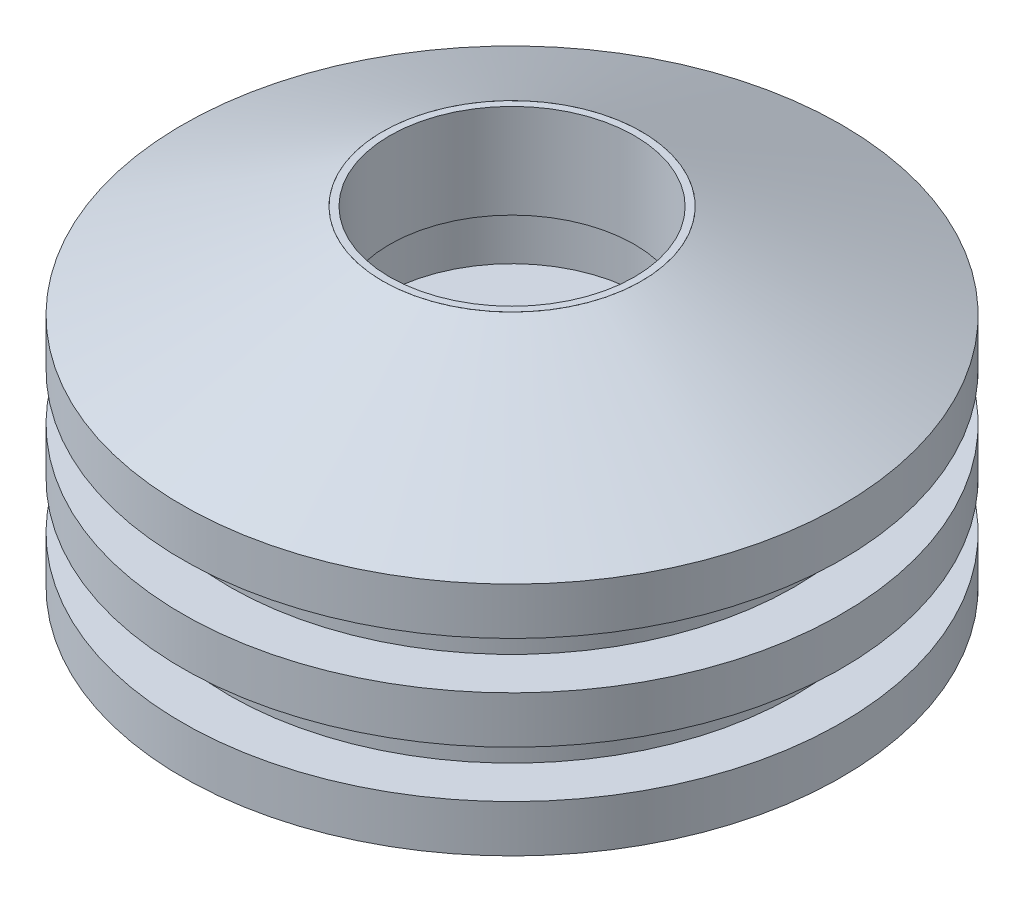
ISO-10303-21;
HEADER;
FILE_DESCRIPTION(('STEP AP214'),'2;1');
FILE_NAME('part.step','',(''),(''),'','','');
FILE_SCHEMA(('AUTOMOTIVE_DESIGN { 1 0 10303 214 1 1 1 1 }'));
ENDSEC;
DATA;
#1=APPLICATION_CONTEXT('core data for automotive mechanical design processes');
#2=APPLICATION_PROTOCOL_DEFINITION('international standard','automotive_design',2000,#1);
#3=PRODUCT_CONTEXT('',#1,'mechanical');
#4=PRODUCT('Part','Part','',(#3));
#5=PRODUCT_RELATED_PRODUCT_CATEGORY('part','',(#4));
#6=PRODUCT_DEFINITION_FORMATION('','',#4);
#7=PRODUCT_DEFINITION_CONTEXT('part definition',#1,'design');
#8=PRODUCT_DEFINITION('design','',#6,#7);
#9=PRODUCT_DEFINITION_SHAPE('','',#8);
#10=(LENGTH_UNIT() NAMED_UNIT(*) SI_UNIT(.MILLI.,.METRE.));
#11=(NAMED_UNIT(*) PLANE_ANGLE_UNIT() SI_UNIT($,.RADIAN.));
#12=(NAMED_UNIT(*) SI_UNIT($,.STERADIAN.) SOLID_ANGLE_UNIT());
#13=UNCERTAINTY_MEASURE_WITH_UNIT(LENGTH_MEASURE(1.E-05),#10,'distance_accuracy_value','');
#14=(GEOMETRIC_REPRESENTATION_CONTEXT(3) GLOBAL_UNCERTAINTY_ASSIGNED_CONTEXT((#13)) GLOBAL_UNIT_ASSIGNED_CONTEXT((#10,
#11,#12)) REPRESENTATION_CONTEXT('',''));
#15=CARTESIAN_POINT('',(0.,0.,0.));
#16=DIRECTION('',(0.,0.,1.));
#17=DIRECTION('',(1.,0.,0.));
#18=AXIS2_PLACEMENT_3D('',#15,#16,#17);
#19=CARTESIAN_POINT('',(0.,0.,0.));
#20=DIRECTION('',(0.,1.,0.));
#21=DIRECTION('',(0.,0.,1.));
#22=AXIS2_PLACEMENT_3D('',#19,#20,#21);
#23=CYLINDRICAL_SURFACE('',#22,8.73125);
#24=CARTESIAN_POINT('',(0.,0.,0.));
#25=DIRECTION('',(0.,1.,0.));
#26=DIRECTION('',(0.,0.,1.));
#27=AXIS2_PLACEMENT_3D('',#24,#25,#26);
#28=CIRCLE('',#27,8.73125);
#29=CARTESIAN_POINT('',(0.,0.,8.73125));
#30=VERTEX_POINT('',#29);
#31=EDGE_CURVE('E11',#30,#30,#28,.T.);
#32=ORIENTED_EDGE('',*,*,#31,.T.);
#33=EDGE_LOOP('',(#32));
#34=FACE_BOUND('',#33,.T.);
#35=CARTESIAN_POINT('',(0.,6.35,0.));
#36=DIRECTION('',(0.,1.,0.));
#37=DIRECTION('',(0.,0.,1.));
#38=AXIS2_PLACEMENT_3D('',#35,#36,#37);
#39=CIRCLE('',#38,8.73125);
#40=CARTESIAN_POINT('',(0.,6.35,8.73125));
#41=VERTEX_POINT('',#40);
#42=EDGE_CURVE('E52',#41,#41,#39,.T.);
#43=ORIENTED_EDGE('',*,*,#42,.F.);
#44=EDGE_LOOP('',(#43));
#45=FACE_BOUND('',#44,.T.);
#46=ADVANCED_FACE('F49',(#34,#45),#23,.T.);
#47=CARTESIAN_POINT('',(0.,0.,0.));
#48=DIRECTION('',(0.,1.,0.));
#49=DIRECTION('',(0.,0.,1.));
#50=AXIS2_PLACEMENT_3D('',#47,#48,#49);
#51=PLANE('',#50);
#52=CARTESIAN_POINT('',(0.,0.,0.));
#53=DIRECTION('',(0.,1.,0.));
#54=DIRECTION('',(0.,0.,1.));
#55=AXIS2_PLACEMENT_3D('',#52,#53,#54);
#56=CIRCLE('',#55,8.255);
#57=CARTESIAN_POINT('',(0.,0.,8.255));
#58=VERTEX_POINT('',#57);
#59=EDGE_CURVE('E59',#58,#58,#56,.T.);
#60=ORIENTED_EDGE('',*,*,#59,.T.);
#61=EDGE_LOOP('',(#60));
#62=FACE_BOUND('',#61,.T.);
#63=ORIENTED_EDGE('',*,*,#31,.F.);
#64=EDGE_LOOP('',(#63));
#65=FACE_BOUND('',#64,.T.);
#66=ADVANCED_FACE('F73',(#62,#65),#51,.F.);
#67=CARTESIAN_POINT('',(0.,6.35,0.));
#68=DIRECTION('',(0.,1.,0.));
#69=DIRECTION('',(0.,0.,1.));
#70=AXIS2_PLACEMENT_3D('',#67,#68,#69);
#71=PLANE('',#70);
#72=CARTESIAN_POINT('',(0.,6.35,0.));
#73=DIRECTION('',(0.,1.,0.));
#74=DIRECTION('',(0.,0.,1.));
#75=AXIS2_PLACEMENT_3D('',#72,#73,#74);
#76=CIRCLE('',#75,8.255);
#77=CARTESIAN_POINT('',(0.,6.35,8.255));
#78=VERTEX_POINT('',#77);
#79=EDGE_CURVE('E63',#78,#78,#76,.T.);
#80=ORIENTED_EDGE('',*,*,#79,.F.);
#81=EDGE_LOOP('',(#80));
#82=FACE_BOUND('',#81,.T.);
#83=ORIENTED_EDGE('',*,*,#42,.T.);
#84=EDGE_LOOP('',(#83));
#85=FACE_BOUND('',#84,.T.);
#86=ADVANCED_FACE('F70',(#82,#85),#71,.T.);
#87=CARTESIAN_POINT('',(0.,-3.175,0.));
#88=DIRECTION('',(0.,1.,0.));
#89=DIRECTION('',(0.,0.,1.));
#90=AXIS2_PLACEMENT_3D('',#87,#88,#89);
#91=CYLINDRICAL_SURFACE('',#90,8.255);
#92=CARTESIAN_POINT('',(0.,6.35,8.255));
#93=CARTESIAN_POINT('',(0.,6.28385416666667,8.255));
#94=CARTESIAN_POINT('',(0.,6.21770833333333,8.255));
#95=CARTESIAN_POINT('',(0.,6.08541666666667,8.255));
#96=CARTESIAN_POINT('',(0.,6.01927083333333,8.255));
#97=CARTESIAN_POINT('',(0.,5.88697916666667,8.255));
#98=CARTESIAN_POINT('',(0.,5.82083333333333,8.255));
#99=CARTESIAN_POINT('',(0.,5.68854166666667,8.255));
#100=CARTESIAN_POINT('',(0.,5.62239583333333,8.255));
#101=CARTESIAN_POINT('',(0.,5.49010416666667,8.255));
#102=CARTESIAN_POINT('',(0.,5.42395833333333,8.255));
#103=CARTESIAN_POINT('',(0.,5.29166666666667,8.255));
#104=CARTESIAN_POINT('',(0.,5.22552083333333,8.255));
#105=CARTESIAN_POINT('',(0.,5.09322916666667,8.255));
#106=CARTESIAN_POINT('',(0.,5.02708333333333,8.255));
#107=CARTESIAN_POINT('',(0.,4.89479166666667,8.255));
#108=CARTESIAN_POINT('',(0.,4.82864583333333,8.255));
#109=CARTESIAN_POINT('',(0.,4.69635416666667,8.255));
#110=CARTESIAN_POINT('',(0.,4.63020833333333,8.255));
#111=CARTESIAN_POINT('',(0.,4.49791666666667,8.255));
#112=CARTESIAN_POINT('',(0.,4.43177083333333,8.255));
#113=CARTESIAN_POINT('',(0.,4.29947916666667,8.255));
#114=CARTESIAN_POINT('',(0.,4.23333333333333,8.255));
#115=CARTESIAN_POINT('',(0.,4.10104166666667,8.255));
#116=CARTESIAN_POINT('',(0.,4.03489583333333,8.255));
#117=CARTESIAN_POINT('',(0.,3.90260416666667,8.255));
#118=CARTESIAN_POINT('',(0.,3.83645833333333,8.255));
#119=CARTESIAN_POINT('',(0.,3.70416666666667,8.255));
#120=CARTESIAN_POINT('',(0.,3.63802083333333,8.255));
#121=CARTESIAN_POINT('',(0.,3.50572916666667,8.255));
#122=CARTESIAN_POINT('',(0.,3.43958333333333,8.255));
#123=CARTESIAN_POINT('',(0.,3.30729166666667,8.255));
#124=CARTESIAN_POINT('',(0.,3.24114583333333,8.255));
#125=CARTESIAN_POINT('',(0.,3.10885416666667,8.255));
#126=CARTESIAN_POINT('',(0.,3.04270833333333,8.255));
#127=CARTESIAN_POINT('',(0.,2.91041666666667,8.255));
#128=CARTESIAN_POINT('',(0.,2.84427083333333,8.255));
#129=CARTESIAN_POINT('',(0.,2.71197916666667,8.255));
#130=CARTESIAN_POINT('',(0.,2.64583333333333,8.255));
#131=CARTESIAN_POINT('',(0.,2.51354166666667,8.255));
#132=CARTESIAN_POINT('',(0.,2.44739583333333,8.255));
#133=CARTESIAN_POINT('',(0.,2.31510416666667,8.255));
#134=CARTESIAN_POINT('',(0.,2.24895833333333,8.255));
#135=CARTESIAN_POINT('',(0.,2.11666666666667,8.255));
#136=CARTESIAN_POINT('',(0.,2.05052083333333,8.255));
#137=CARTESIAN_POINT('',(0.,1.91822916666667,8.255));
#138=CARTESIAN_POINT('',(0.,1.85208333333333,8.255));
#139=CARTESIAN_POINT('',(0.,1.71979166666667,8.255));
#140=CARTESIAN_POINT('',(0.,1.65364583333333,8.255));
#141=CARTESIAN_POINT('',(0.,1.52135416666667,8.255));
#142=CARTESIAN_POINT('',(0.,1.45520833333333,8.255));
#143=CARTESIAN_POINT('',(0.,1.32291666666667,8.255));
#144=CARTESIAN_POINT('',(0.,1.25677083333333,8.255));
#145=CARTESIAN_POINT('',(0.,1.12447916666667,8.255));
#146=CARTESIAN_POINT('',(0.,1.05833333333333,8.255));
#147=CARTESIAN_POINT('',(0.,0.926041666666666,8.255));
#148=CARTESIAN_POINT('',(0.,0.859895833333333,8.255));
#149=CARTESIAN_POINT('',(0.,0.727604166666666,8.255));
#150=CARTESIAN_POINT('',(0.,0.661458333333333,8.255));
#151=CARTESIAN_POINT('',(0.,0.529166666666666,8.255));
#152=CARTESIAN_POINT('',(0.,0.463020833333333,8.255));
#153=CARTESIAN_POINT('',(0.,0.330729166666666,8.255));
#154=CARTESIAN_POINT('',(0.,0.264583333333333,8.255));
#155=CARTESIAN_POINT('',(0.,0.132291666666666,8.255));
#156=CARTESIAN_POINT('',(0.,0.0661458333333329,8.255));
#157=CARTESIAN_POINT('',(0.,0.,8.255));
#158=B_SPLINE_CURVE_WITH_KNOTS('',3,(#92,#93,#94,#95,#96,#97,#98,#99,#100,#101,#102,#103,#104,
#105,#106,#107,#108,#109,#110,#111,#112,#113,#114,#115,#116,#117,#118,#119,#120,#121,#122,#123,
#124,#125,#126,#127,#128,#129,#130,#131,#132,#133,#134,#135,#136,#137,#138,#139,#140,#141,#142,
#143,#144,#145,#146,#147,#148,#149,#150,#151,#152,#153,#154,#155,#156,#157),.UNSPECIFIED.,.F.,
.F.,(4,2,2,2,2,2,2,2,2,2,2,2,2,2,2,2,2,2,2,2,2,2,2,2,2,2,2,2,2,2,2,2,4),(0.,0.198437500000001,
0.396875,0.5953125,0.793749999999999,0.9921875,1.190625,1.3890625,1.5875,1.7859375,1.984375,
2.1828125,2.38125,2.5796875,2.778125,2.9765625,3.175,3.3734375,3.571875,3.7703125,3.96875,
4.1671875,4.365625,4.5640625,4.7625,4.9609375,5.159375,5.3578125,5.55625,5.7546875,5.953125,
6.1515625,6.35),.UNSPECIFIED.);
#159=EDGE_CURVE('BSEAM67',#78,#58,#158,.T.);
#160=ORIENTED_EDGE('',*,*,#79,.T.);
#161=ORIENTED_EDGE('',*,*,#59,.F.);
#162=ORIENTED_EDGE('',*,*,#159,.T.);
#163=ORIENTED_EDGE('',*,*,#159,.F.);
#164=EDGE_LOOP('',(#160,#162,#161,#163));
#165=FACE_BOUND('',#164,.T.);
#166=ADVANCED_FACE('F67',(#165),#91,.F.);
#167=CLOSED_SHELL('',(#46,#66,#86,#166));
#168=MANIFOLD_SOLID_BREP('B2',#167);
#169=CARTESIAN_POINT('',(0.,-15.875,0.));
#170=DIRECTION('',(0.,-1.,0.));
#171=DIRECTION('',(0.,0.,-1.));
#172=AXIS2_PLACEMENT_3D('',#169,#170,#171);
#173=PLANE('',#172);
#174=CARTESIAN_POINT('',(0.,-15.875,0.));
#175=DIRECTION('',(0.,-1.,0.));
#176=DIRECTION('',(0.,0.,-1.));
#177=AXIS2_PLACEMENT_3D('',#174,#175,#176);
#178=CIRCLE('',#177,22.225);
#179=CARTESIAN_POINT('',(0.,-15.875,-22.225));
#180=VERTEX_POINT('',#179);
#181=EDGE_CURVE('E323',#180,#180,#178,.T.);
#182=ORIENTED_EDGE('',*,*,#181,.T.);
#183=EDGE_LOOP('',(#182));
#184=FACE_BOUND('',#183,.T.);
#185=CARTESIAN_POINT('',(0.,-15.875,0.));
#186=DIRECTION('',(0.,-1.,0.));
#187=DIRECTION('',(0.,0.,-1.));
#188=AXIS2_PLACEMENT_3D('',#185,#186,#187);
#189=CIRCLE('',#188,2.7051);
#190=CARTESIAN_POINT('',(0.,-15.875,-2.7051));
#191=VERTEX_POINT('',#190);
#192=EDGE_CURVE('E313',#191,#191,#189,.F.);
#193=ORIENTED_EDGE('',*,*,#192,.T.);
#194=EDGE_LOOP('',(#193));
#195=FACE_BOUND('',#194,.T.);
#196=ADVANCED_FACE('F111',(#184,#195),#173,.T.);
#197=CARTESIAN_POINT('',(0.,0.,0.));
#198=DIRECTION('',(0.,-1.,0.));
#199=DIRECTION('',(0.,0.,-1.));
#200=AXIS2_PLACEMENT_3D('',#197,#198,#199);
#201=CYLINDRICAL_SURFACE('',#200,8.73125);
#202=CARTESIAN_POINT('',(0.,6.35,0.));
#203=DIRECTION('',(0.,-1.,0.));
#204=DIRECTION('',(0.,0.,-1.));
#205=AXIS2_PLACEMENT_3D('',#202,#203,#204);
#206=CIRCLE('',#205,8.73125);
#207=CARTESIAN_POINT('',(0.,6.35,-8.73125));
#208=VERTEX_POINT('',#207);
#209=EDGE_CURVE('E150',#208,#208,#206,.T.);
#210=ORIENTED_EDGE('',*,*,#209,.F.);
#211=EDGE_LOOP('',(#210));
#212=FACE_BOUND('',#211,.T.);
#213=CARTESIAN_POINT('',(0.,-3.175,0.));
#214=DIRECTION('',(0.,-1.,0.));
#215=DIRECTION('',(0.,0.,-1.));
#216=AXIS2_PLACEMENT_3D('',#213,#214,#215);
#217=CIRCLE('',#216,8.73125);
#218=CARTESIAN_POINT('',(0.,-3.175,-8.73125));
#219=VERTEX_POINT('',#218);
#220=EDGE_CURVE('E142',#219,#219,#217,.T.);
#221=ORIENTED_EDGE('',*,*,#220,.T.);
#222=EDGE_LOOP('',(#221));
#223=FACE_BOUND('',#222,.T.);
#224=ADVANCED_FACE('F113',(#212,#223),#201,.F.);
#225=CARTESIAN_POINT('',(0.,0.,0.));
#226=DIRECTION('',(0.,-1.,0.));
#227=DIRECTION('',(0.,0.,-1.));
#228=AXIS2_PLACEMENT_3D('',#225,#226,#227);
#229=CONICAL_SURFACE('',#228,22.225,1.13095374397916);
#230=ORIENTED_EDGE('',*,*,#209,.T.);
#231=EDGE_LOOP('',(#230));
#232=FACE_BOUND('',#231,.T.);
#233=CARTESIAN_POINT('',(0.,0.,0.));
#234=DIRECTION('',(0.,-1.,0.));
#235=DIRECTION('',(0.,0.,-1.));
#236=AXIS2_PLACEMENT_3D('',#233,#234,#235);
#237=CIRCLE('',#236,22.225);
#238=CARTESIAN_POINT('',(0.,0.,-22.225));
#239=VERTEX_POINT('',#238);
#240=EDGE_CURVE('E115',#239,#239,#237,.T.);
#241=ORIENTED_EDGE('',*,*,#240,.F.);
#242=EDGE_LOOP('',(#241));
#243=FACE_BOUND('',#242,.T.);
#244=ADVANCED_FACE('F161',(#232,#243),#229,.T.);
#245=CARTESIAN_POINT('',(0.,-3.175,0.));
#246=DIRECTION('',(0.,-1.,0.));
#247=DIRECTION('',(0.,0.,-1.));
#248=AXIS2_PLACEMENT_3D('',#245,#246,#247);
#249=PLANE('',#248);
#250=CARTESIAN_POINT('',(0.,-3.175,0.));
#251=DIRECTION('',(0.,-1.,0.));
#252=DIRECTION('',(0.,0.,-1.));
#253=AXIS2_PLACEMENT_3D('',#250,#251,#252);
#254=CIRCLE('',#253,19.05);
#255=CARTESIAN_POINT('',(0.,-3.175,-19.05));
#256=VERTEX_POINT('',#255);
#257=EDGE_CURVE('E120',#256,#256,#254,.T.);
#258=ORIENTED_EDGE('',*,*,#257,.F.);
#259=EDGE_LOOP('',(#258));
#260=FACE_BOUND('',#259,.T.);
#261=CARTESIAN_POINT('',(0.,-3.175,0.));
#262=DIRECTION('',(0.,-1.,0.));
#263=DIRECTION('',(0.,0.,-1.));
#264=AXIS2_PLACEMENT_3D('',#261,#262,#263);
#265=CIRCLE('',#264,22.225);
#266=CARTESIAN_POINT('',(0.,-3.175,-22.225));
#267=VERTEX_POINT('',#266);
#268=EDGE_CURVE('E147',#267,#267,#265,.T.);
#269=ORIENTED_EDGE('',*,*,#268,.T.);
#270=EDGE_LOOP('',(#269));
#271=FACE_BOUND('',#270,.T.);
#272=ADVANCED_FACE('F163',(#260,#271),#249,.T.);
#273=CARTESIAN_POINT('',(0.,-3.175,0.));
#274=DIRECTION('',(0.,1.,0.));
#275=DIRECTION('',(0.,0.,1.));
#276=AXIS2_PLACEMENT_3D('',#273,#274,#275);
#277=CYLINDRICAL_SURFACE('',#276,22.225);
#278=ORIENTED_EDGE('',*,*,#268,.F.);
#279=EDGE_LOOP('',(#278));
#280=FACE_BOUND('',#279,.T.);
#281=ORIENTED_EDGE('',*,*,#240,.T.);
#282=EDGE_LOOP('',(#281));
#283=FACE_BOUND('',#282,.T.);
#284=ADVANCED_FACE('F159',(#280,#283),#277,.T.);
#285=CARTESIAN_POINT('',(0.,-6.35,0.));
#286=DIRECTION('',(0.,1.,0.));
#287=DIRECTION('',(0.,0.,1.));
#288=AXIS2_PLACEMENT_3D('',#285,#286,#287);
#289=CYLINDRICAL_SURFACE('',#288,19.05);
#290=CARTESIAN_POINT('',(0.,-6.35,0.));
#291=DIRECTION('',(0.,-1.,0.));
#292=DIRECTION('',(0.,0.,-1.));
#293=AXIS2_PLACEMENT_3D('',#290,#291,#292);
#294=CIRCLE('',#293,19.05);
#295=CARTESIAN_POINT('',(0.,-6.35,-19.05));
#296=VERTEX_POINT('',#295);
#297=EDGE_CURVE('E135',#296,#296,#294,.T.);
#298=ORIENTED_EDGE('',*,*,#297,.F.);
#299=EDGE_LOOP('',(#298));
#300=FACE_BOUND('',#299,.T.);
#301=ORIENTED_EDGE('',*,*,#257,.T.);
#302=EDGE_LOOP('',(#301));
#303=FACE_BOUND('',#302,.T.);
#304=ADVANCED_FACE('F209',(#300,#303),#289,.T.);
#305=CARTESIAN_POINT('',(0.,-3.175,0.));
#306=DIRECTION('',(0.,-1.,0.));
#307=DIRECTION('',(0.,0.,-1.));
#308=AXIS2_PLACEMENT_3D('',#305,#306,#307);
#309=PLANE('',#308);
#310=CARTESIAN_POINT('',(0.,-3.175,0.));
#311=DIRECTION('',(0.,1.,0.));
#312=DIRECTION('',(0.,0.,1.));
#313=AXIS2_PLACEMENT_3D('',#310,#311,#312);
#314=CIRCLE('',#313,2.7051);
#315=CARTESIAN_POINT('',(0.,-3.175,2.7051));
#316=VERTEX_POINT('',#315);
#317=EDGE_CURVE('E316',#316,#316,#314,.T.);
#318=ORIENTED_EDGE('',*,*,#317,.F.);
#319=EDGE_LOOP('',(#318));
#320=FACE_BOUND('',#319,.T.);
#321=ORIENTED_EDGE('',*,*,#220,.F.);
#322=EDGE_LOOP('',(#321));
#323=FACE_BOUND('',#322,.T.);
#324=ADVANCED_FACE('F205',(#320,#323),#309,.F.);
#325=CARTESIAN_POINT('',(0.,-9.525,0.));
#326=DIRECTION('',(0.,1.,0.));
#327=DIRECTION('',(0.,0.,1.));
#328=AXIS2_PLACEMENT_3D('',#325,#326,#327);
#329=CYLINDRICAL_SURFACE('',#328,22.225);
#330=CARTESIAN_POINT('',(0.,-9.525,0.));
#331=DIRECTION('',(0.,-1.,0.));
#332=DIRECTION('',(0.,0.,-1.));
#333=AXIS2_PLACEMENT_3D('',#330,#331,#332);
#334=CIRCLE('',#333,22.225);
#335=CARTESIAN_POINT('',(0.,-9.525,-22.225));
#336=VERTEX_POINT('',#335);
#337=EDGE_CURVE('E131',#336,#336,#334,.T.);
#338=ORIENTED_EDGE('',*,*,#337,.F.);
#339=EDGE_LOOP('',(#338));
#340=FACE_BOUND('',#339,.T.);
#341=CARTESIAN_POINT('',(0.,-6.35,0.));
#342=DIRECTION('',(0.,-1.,0.));
#343=DIRECTION('',(0.,0.,-1.));
#344=AXIS2_PLACEMENT_3D('',#341,#342,#343);
#345=CIRCLE('',#344,22.225);
#346=CARTESIAN_POINT('',(0.,-6.35,-22.225));
#347=VERTEX_POINT('',#346);
#348=EDGE_CURVE('E136',#347,#347,#345,.T.);
#349=ORIENTED_EDGE('',*,*,#348,.T.);
#350=EDGE_LOOP('',(#349));
#351=FACE_BOUND('',#350,.T.);
#352=ADVANCED_FACE('F198',(#340,#351),#329,.T.);
#353=CARTESIAN_POINT('',(0.,-9.525,0.));
#354=DIRECTION('',(0.,-1.,0.));
#355=DIRECTION('',(0.,0.,-1.));
#356=AXIS2_PLACEMENT_3D('',#353,#354,#355);
#357=PLANE('',#356);
#358=CARTESIAN_POINT('',(0.,-9.525,0.));
#359=DIRECTION('',(0.,-1.,0.));
#360=DIRECTION('',(0.,0.,-1.));
#361=AXIS2_PLACEMENT_3D('',#358,#359,#360);
#362=CIRCLE('',#361,19.05);
#363=CARTESIAN_POINT('',(0.,-9.525,-19.05));
#364=VERTEX_POINT('',#363);
#365=EDGE_CURVE('E48',#364,#364,#362,.T.);
#366=ORIENTED_EDGE('',*,*,#365,.F.);
#367=EDGE_LOOP('',(#366));
#368=FACE_BOUND('',#367,.T.);
#369=ORIENTED_EDGE('',*,*,#337,.T.);
#370=EDGE_LOOP('',(#369));
#371=FACE_BOUND('',#370,.T.);
#372=ADVANCED_FACE('F195',(#368,#371),#357,.T.);
#373=CARTESIAN_POINT('',(0.,-6.35,0.));
#374=DIRECTION('',(0.,-1.,0.));
#375=DIRECTION('',(0.,0.,-1.));
#376=AXIS2_PLACEMENT_3D('',#373,#374,#375);
#377=PLANE('',#376);
#378=ORIENTED_EDGE('',*,*,#297,.T.);
#379=EDGE_LOOP('',(#378));
#380=FACE_BOUND('',#379,.T.);
#381=ORIENTED_EDGE('',*,*,#348,.F.);
#382=EDGE_LOOP('',(#381));
#383=FACE_BOUND('',#382,.T.);
#384=ADVANCED_FACE('F193',(#380,#383),#377,.F.);
#385=CARTESIAN_POINT('',(0.,-12.7,0.));
#386=DIRECTION('',(0.,1.,0.));
#387=DIRECTION('',(0.,0.,1.));
#388=AXIS2_PLACEMENT_3D('',#385,#386,#387);
#389=CYLINDRICAL_SURFACE('',#388,19.05);
#390=CARTESIAN_POINT('',(0.,-12.7,0.));
#391=DIRECTION('',(0.,-1.,0.));
#392=DIRECTION('',(0.,0.,-1.));
#393=AXIS2_PLACEMENT_3D('',#390,#391,#392);
#394=CIRCLE('',#393,19.05);
#395=CARTESIAN_POINT('',(0.,-12.7,-19.05));
#396=VERTEX_POINT('',#395);
#397=EDGE_CURVE('E129',#396,#396,#394,.T.);
#398=ORIENTED_EDGE('',*,*,#397,.F.);
#399=EDGE_LOOP('',(#398));
#400=FACE_BOUND('',#399,.T.);
#401=ORIENTED_EDGE('',*,*,#365,.T.);
#402=EDGE_LOOP('',(#401));
#403=FACE_BOUND('',#402,.T.);
#404=ADVANCED_FACE('F189',(#400,#403),#389,.T.);
#405=CARTESIAN_POINT('',(0.,-15.875,0.));
#406=DIRECTION('',(0.,1.,0.));
#407=DIRECTION('',(0.,0.,1.));
#408=AXIS2_PLACEMENT_3D('',#405,#406,#407);
#409=CYLINDRICAL_SURFACE('',#408,22.225);
#410=ORIENTED_EDGE('',*,*,#181,.F.);
#411=EDGE_LOOP('',(#410));
#412=FACE_BOUND('',#411,.T.);
#413=CARTESIAN_POINT('',(0.,-12.7,0.));
#414=DIRECTION('',(0.,-1.,0.));
#415=DIRECTION('',(0.,0.,-1.));
#416=AXIS2_PLACEMENT_3D('',#413,#414,#415);
#417=CIRCLE('',#416,22.225);
#418=CARTESIAN_POINT('',(0.,-12.7,-22.225));
#419=VERTEX_POINT('',#418);
#420=EDGE_CURVE('E320',#419,#419,#417,.T.);
#421=ORIENTED_EDGE('',*,*,#420,.T.);
#422=EDGE_LOOP('',(#421));
#423=FACE_BOUND('',#422,.T.);
#424=ADVANCED_FACE('F185',(#412,#423),#409,.T.);
#425=CARTESIAN_POINT('',(0.,-12.7,0.));
#426=DIRECTION('',(0.,-1.,0.));
#427=DIRECTION('',(0.,0.,-1.));
#428=AXIS2_PLACEMENT_3D('',#425,#426,#427);
#429=PLANE('',#428);
#430=ORIENTED_EDGE('',*,*,#397,.T.);
#431=EDGE_LOOP('',(#430));
#432=FACE_BOUND('',#431,.T.);
#433=ORIENTED_EDGE('',*,*,#420,.F.);
#434=EDGE_LOOP('',(#433));
#435=FACE_BOUND('',#434,.T.);
#436=ADVANCED_FACE('F182',(#432,#435),#429,.F.);
#437=CARTESIAN_POINT('',(0.,-3.175,0.));
#438=DIRECTION('',(0.,1.,0.));
#439=DIRECTION('',(0.,0.,1.));
#440=AXIS2_PLACEMENT_3D('',#437,#438,#439);
#441=CYLINDRICAL_SURFACE('',#440,2.7051);
#442=ORIENTED_EDGE('',*,*,#192,.F.);
#443=EDGE_LOOP('',(#442));
#444=FACE_BOUND('',#443,.T.);
#445=ORIENTED_EDGE('',*,*,#317,.T.);
#446=EDGE_LOOP('',(#445));
#447=FACE_BOUND('',#446,.T.);
#448=ADVANCED_FACE('F181',(#444,#447),#441,.F.);
#449=CLOSED_SHELL('',(#196,#224,#244,#272,#284,#304,#324,#352,#372,#384,#404,#424,#436,#448));
#450=MANIFOLD_SOLID_BREP('B6',#449);
#451=ADVANCED_BREP_SHAPE_REPRESENTATION('',(#18,#168,#450),#14);
#452=SHAPE_DEFINITION_REPRESENTATION(#9,#451);
ENDSEC;
END-ISO-10303-21;
